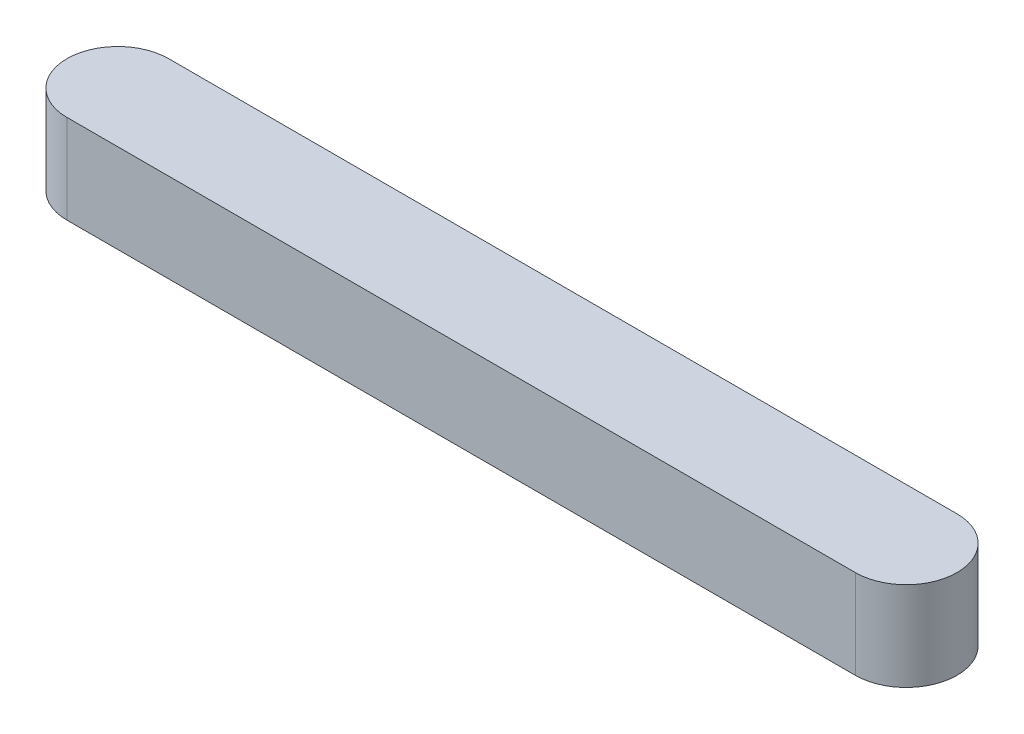
ISO-10303-21;
HEADER;
FILE_DESCRIPTION(('STEP AP214'),'2;1');
FILE_NAME('part.step','',(''),(''),'','','');
FILE_SCHEMA(('AUTOMOTIVE_DESIGN { 1 0 10303 214 1 1 1 1 }'));
ENDSEC;
DATA;
#1=APPLICATION_CONTEXT('core data for automotive mechanical design processes');
#2=APPLICATION_PROTOCOL_DEFINITION('international standard','automotive_design',2000,#1);
#3=PRODUCT_CONTEXT('',#1,'mechanical');
#4=PRODUCT('Part','Part','',(#3));
#5=PRODUCT_RELATED_PRODUCT_CATEGORY('part','',(#4));
#6=PRODUCT_DEFINITION_FORMATION('','',#4);
#7=PRODUCT_DEFINITION_CONTEXT('part definition',#1,'design');
#8=PRODUCT_DEFINITION('design','',#6,#7);
#9=PRODUCT_DEFINITION_SHAPE('','',#8);
#10=(LENGTH_UNIT() NAMED_UNIT(*) SI_UNIT(.MILLI.,.METRE.));
#11=(NAMED_UNIT(*) PLANE_ANGLE_UNIT() SI_UNIT($,.RADIAN.));
#12=(NAMED_UNIT(*) SI_UNIT($,.STERADIAN.) SOLID_ANGLE_UNIT());
#13=UNCERTAINTY_MEASURE_WITH_UNIT(LENGTH_MEASURE(1.E-05),#10,'distance_accuracy_value','');
#14=(GEOMETRIC_REPRESENTATION_CONTEXT(3) GLOBAL_UNCERTAINTY_ASSIGNED_CONTEXT((#13)) GLOBAL_UNIT_ASSIGNED_CONTEXT((#10,
#11,#12)) REPRESENTATION_CONTEXT('',''));
#15=CARTESIAN_POINT('',(0.,0.,0.));
#16=DIRECTION('',(0.,0.,1.));
#17=DIRECTION('',(1.,0.,0.));
#18=AXIS2_PLACEMENT_3D('',#15,#16,#17);
#19=CARTESIAN_POINT('',(0.,7.,0.));
#20=DIRECTION('',(0.,-1.,0.));
#21=DIRECTION('',(0.,0.,-1.));
#22=AXIS2_PLACEMENT_3D('',#19,#20,#21);
#23=CYLINDRICAL_SURFACE('',#22,4.);
#24=CARTESIAN_POINT('',(0.,0.,0.));
#25=DIRECTION('',(0.,1.,0.));
#26=DIRECTION('',(0.,0.,1.));
#27=AXIS2_PLACEMENT_3D('',#24,#25,#26);
#28=CIRCLE('',#27,4.);
#29=CARTESIAN_POINT('',(0.,0.,-4.));
#30=VERTEX_POINT('',#29);
#31=CARTESIAN_POINT('',(0.,0.,4.));
#32=VERTEX_POINT('',#31);
#33=EDGE_CURVE('E98',#30,#32,#28,.T.);
#34=ORIENTED_EDGE('',*,*,#33,.T.);
#35=DIRECTION('',(0.,-1.,0.));
#36=VECTOR('',#35,1.);
#37=CARTESIAN_POINT('',(0.,7.,4.));
#38=LINE('',#37,#36);
#39=CARTESIAN_POINT('',(0.,7.,4.));
#40=VERTEX_POINT('',#39);
#41=EDGE_CURVE('E11',#40,#32,#38,.T.);
#42=ORIENTED_EDGE('',*,*,#41,.F.);
#43=CARTESIAN_POINT('',(0.,7.,0.));
#44=DIRECTION('',(0.,1.,0.));
#45=DIRECTION('',(0.,0.,1.));
#46=AXIS2_PLACEMENT_3D('',#43,#44,#45);
#47=CIRCLE('',#46,4.);
#48=CARTESIAN_POINT('',(0.,7.,-4.));
#49=VERTEX_POINT('',#48);
#50=EDGE_CURVE('E86',#49,#40,#47,.T.);
#51=ORIENTED_EDGE('',*,*,#50,.F.);
#52=DIRECTION('',(0.,-1.,0.));
#53=VECTOR('',#52,1.);
#54=CARTESIAN_POINT('',(0.,7.,-4.));
#55=LINE('',#54,#53);
#56=EDGE_CURVE('E94',#49,#30,#55,.T.);
#57=ORIENTED_EDGE('',*,*,#56,.T.);
#58=EDGE_LOOP('',(#34,#42,#51,#57));
#59=FACE_BOUND('',#58,.T.);
#60=ADVANCED_FACE('F35',(#59),#23,.T.);
#61=CARTESIAN_POINT('',(0.,7.,4.));
#62=DIRECTION('',(0.,0.,-1.));
#63=DIRECTION('',(-1.,0.,0.));
#64=AXIS2_PLACEMENT_3D('',#61,#62,#63);
#65=PLANE('',#64);
#66=DIRECTION('',(1.,0.,0.));
#67=VECTOR('',#66,1.);
#68=CARTESIAN_POINT('',(0.,0.,4.));
#69=LINE('',#68,#67);
#70=CARTESIAN_POINT('',(62.,0.,4.));
#71=VERTEX_POINT('',#70);
#72=EDGE_CURVE('E90',#32,#71,#69,.T.);
#73=ORIENTED_EDGE('',*,*,#72,.T.);
#74=DIRECTION('',(0.,-1.,0.));
#75=VECTOR('',#74,1.);
#76=CARTESIAN_POINT('',(62.,7.,4.));
#77=LINE('',#76,#75);
#78=CARTESIAN_POINT('',(62.,7.,4.));
#79=VERTEX_POINT('',#78);
#80=EDGE_CURVE('E43',#79,#71,#77,.T.);
#81=ORIENTED_EDGE('',*,*,#80,.F.);
#82=DIRECTION('',(1.,0.,0.));
#83=VECTOR('',#82,1.);
#84=CARTESIAN_POINT('',(0.,7.,4.));
#85=LINE('',#84,#83);
#86=EDGE_CURVE('E81',#40,#79,#85,.T.);
#87=ORIENTED_EDGE('',*,*,#86,.F.);
#88=ORIENTED_EDGE('',*,*,#41,.T.);
#89=EDGE_LOOP('',(#73,#81,#87,#88));
#90=FACE_BOUND('',#89,.T.);
#91=ADVANCED_FACE('F89',(#90),#65,.F.);
#92=CARTESIAN_POINT('',(62.,7.,0.));
#93=DIRECTION('',(0.,-1.,0.));
#94=DIRECTION('',(0.,0.,-1.));
#95=AXIS2_PLACEMENT_3D('',#92,#93,#94);
#96=CYLINDRICAL_SURFACE('',#95,4.);
#97=CARTESIAN_POINT('',(62.,0.,0.));
#98=DIRECTION('',(0.,1.,0.));
#99=DIRECTION('',(0.,0.,1.));
#100=AXIS2_PLACEMENT_3D('',#97,#98,#99);
#101=CIRCLE('',#100,4.);
#102=CARTESIAN_POINT('',(62.,0.,-4.));
#103=VERTEX_POINT('',#102);
#104=EDGE_CURVE('E68',#71,#103,#101,.T.);
#105=ORIENTED_EDGE('',*,*,#104,.T.);
#106=DIRECTION('',(0.,-1.,0.));
#107=VECTOR('',#106,1.);
#108=CARTESIAN_POINT('',(62.,7.,-4.));
#109=LINE('',#108,#107);
#110=CARTESIAN_POINT('',(62.,7.,-4.));
#111=VERTEX_POINT('',#110);
#112=EDGE_CURVE('E91',#111,#103,#109,.T.);
#113=ORIENTED_EDGE('',*,*,#112,.F.);
#114=CARTESIAN_POINT('',(62.,7.,0.));
#115=DIRECTION('',(0.,1.,0.));
#116=DIRECTION('',(0.,0.,1.));
#117=AXIS2_PLACEMENT_3D('',#114,#115,#116);
#118=CIRCLE('',#117,4.);
#119=EDGE_CURVE('E84',#79,#111,#118,.T.);
#120=ORIENTED_EDGE('',*,*,#119,.F.);
#121=ORIENTED_EDGE('',*,*,#80,.T.);
#122=EDGE_LOOP('',(#105,#113,#120,#121));
#123=FACE_BOUND('',#122,.T.);
#124=ADVANCED_FACE('F92',(#123),#96,.T.);
#125=CARTESIAN_POINT('',(0.,7.,-4.));
#126=DIRECTION('',(0.,0.,1.));
#127=DIRECTION('',(1.,0.,0.));
#128=AXIS2_PLACEMENT_3D('',#125,#126,#127);
#129=PLANE('',#128);
#130=DIRECTION('',(-1.,0.,0.));
#131=VECTOR('',#130,1.);
#132=CARTESIAN_POINT('',(0.,0.,-4.));
#133=LINE('',#132,#131);
#134=EDGE_CURVE('E74',#103,#30,#133,.T.);
#135=ORIENTED_EDGE('',*,*,#134,.T.);
#136=ORIENTED_EDGE('',*,*,#56,.F.);
#137=DIRECTION('',(-1.,0.,0.));
#138=VECTOR('',#137,1.);
#139=CARTESIAN_POINT('',(0.,7.,-4.));
#140=LINE('',#139,#138);
#141=EDGE_CURVE('E51',#111,#49,#140,.T.);
#142=ORIENTED_EDGE('',*,*,#141,.F.);
#143=ORIENTED_EDGE('',*,*,#112,.T.);
#144=EDGE_LOOP('',(#135,#136,#142,#143));
#145=FACE_BOUND('',#144,.T.);
#146=ADVANCED_FACE('F105',(#145),#129,.F.);
#147=CARTESIAN_POINT('',(0.,7.,0.));
#148=DIRECTION('',(0.,1.,0.));
#149=DIRECTION('',(0.,0.,1.));
#150=AXIS2_PLACEMENT_3D('',#147,#148,#149);
#151=PLANE('',#150);
#152=ORIENTED_EDGE('',*,*,#50,.T.);
#153=ORIENTED_EDGE('',*,*,#86,.T.);
#154=ORIENTED_EDGE('',*,*,#119,.T.);
#155=ORIENTED_EDGE('',*,*,#141,.T.);
#156=EDGE_LOOP('',(#152,#153,#154,#155));
#157=FACE_BOUND('',#156,.T.);
#158=ADVANCED_FACE('F82',(#157),#151,.T.);
#159=CARTESIAN_POINT('',(0.,0.,0.));
#160=DIRECTION('',(0.,1.,0.));
#161=DIRECTION('',(0.,0.,1.));
#162=AXIS2_PLACEMENT_3D('',#159,#160,#161);
#163=PLANE('',#162);
#164=ORIENTED_EDGE('',*,*,#33,.F.);
#165=ORIENTED_EDGE('',*,*,#134,.F.);
#166=ORIENTED_EDGE('',*,*,#104,.F.);
#167=ORIENTED_EDGE('',*,*,#72,.F.);
#168=EDGE_LOOP('',(#164,#165,#166,#167));
#169=FACE_BOUND('',#168,.T.);
#170=ADVANCED_FACE('F108',(#169),#163,.F.);
#171=CLOSED_SHELL('',(#60,#91,#124,#146,#158,#170));
#172=MANIFOLD_SOLID_BREP('B2',#171);
#173=ADVANCED_BREP_SHAPE_REPRESENTATION('',(#18,#172),#14);
#174=SHAPE_DEFINITION_REPRESENTATION(#9,#173);
ENDSEC;
END-ISO-10303-21;
